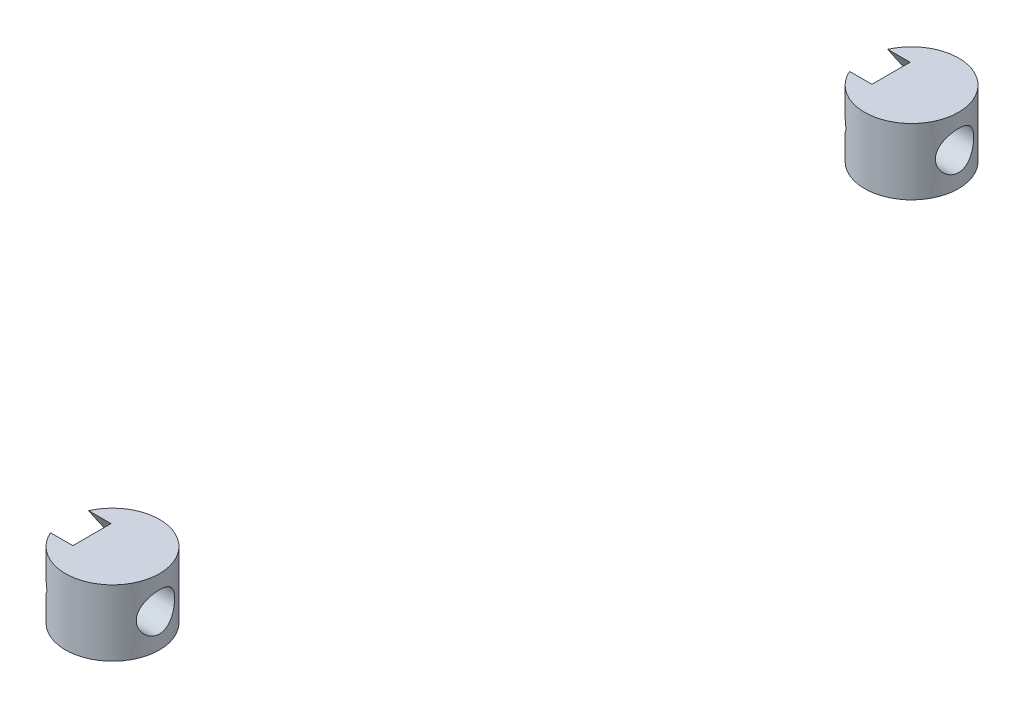
ISO-10303-21;
HEADER;
FILE_DESCRIPTION(('STEP AP214'),'2;1');
FILE_NAME('part.step','',(''),(''),'','','');
FILE_SCHEMA(('AUTOMOTIVE_DESIGN { 1 0 10303 214 1 1 1 1 }'));
ENDSEC;
DATA;
#1=APPLICATION_CONTEXT('core data for automotive mechanical design processes');
#2=APPLICATION_PROTOCOL_DEFINITION('international standard','automotive_design',2000,#1);
#3=PRODUCT_CONTEXT('',#1,'mechanical');
#4=PRODUCT('Part','Part','',(#3));
#5=PRODUCT_RELATED_PRODUCT_CATEGORY('part','',(#4));
#6=PRODUCT_DEFINITION_FORMATION('','',#4);
#7=PRODUCT_DEFINITION_CONTEXT('part definition',#1,'design');
#8=PRODUCT_DEFINITION('design','',#6,#7);
#9=PRODUCT_DEFINITION_SHAPE('','',#8);
#10=(LENGTH_UNIT() NAMED_UNIT(*) SI_UNIT(.MILLI.,.METRE.));
#11=(NAMED_UNIT(*) PLANE_ANGLE_UNIT() SI_UNIT($,.RADIAN.));
#12=(NAMED_UNIT(*) SI_UNIT($,.STERADIAN.) SOLID_ANGLE_UNIT());
#13=UNCERTAINTY_MEASURE_WITH_UNIT(LENGTH_MEASURE(1.E-05),#10,'distance_accuracy_value','');
#14=(GEOMETRIC_REPRESENTATION_CONTEXT(3) GLOBAL_UNCERTAINTY_ASSIGNED_CONTEXT((#13)) GLOBAL_UNIT_ASSIGNED_CONTEXT((#10,
#11,#12)) REPRESENTATION_CONTEXT('',''));
#15=CARTESIAN_POINT('',(0.,0.,0.));
#16=DIRECTION('',(0.,0.,1.));
#17=DIRECTION('',(1.,0.,0.));
#18=AXIS2_PLACEMENT_3D('',#15,#16,#17);
#19=CARTESIAN_POINT('',(-9.025,6.35,76.7));
#20=DIRECTION('',(1.,0.,0.));
#21=DIRECTION('',(0.,0.,-1.));
#22=AXIS2_PLACEMENT_3D('',#19,#20,#21);
#23=CYLINDRICAL_SURFACE('',#22,3.675);
#24=CARTESIAN_POINT('',(8.24287571178894,6.35,73.025));
#25=CARTESIAN_POINT('',(8.24287635200835,6.25172209193004,73.0250006435663));
#26=CARTESIAN_POINT('',(8.24463950445115,6.15340636895207,73.0289482242921));
#27=CARTESIAN_POINT('',(8.2516341947821,5.95748755176273,73.0446983826287));
#28=CARTESIAN_POINT('',(8.25686806215964,5.85988498072126,73.0565062359517));
#29=CARTESIAN_POINT('',(8.27064458742844,5.66594535724324,73.0878872681414));
#30=CARTESIAN_POINT('',(8.27919443665083,5.56961152904888,73.1074773264413));
#31=CARTESIAN_POINT('',(8.29931572789662,5.37910343025143,73.1542104976651));
#32=CARTESIAN_POINT('',(8.31088843780253,5.28493008389492,73.1813567802206));
#33=CARTESIAN_POINT('',(8.34950112738415,5.00742795623176,73.2734965304055));
#34=CARTESIAN_POINT('',(8.38051193052206,4.8281262358787,73.349354005083));
#35=CARTESIAN_POINT('',(8.44955969315188,4.48494141418247,73.5275187377141));
#36=CARTESIAN_POINT('',(8.48759476947754,4.32105419803325,73.6298189094671));
#37=CARTESIAN_POINT('',(8.56894038089361,4.00339374462748,73.8644933161994));
#38=CARTESIAN_POINT('',(8.61242467515415,3.85063969934235,73.9981899136823));
#39=CARTESIAN_POINT('',(8.69833612153945,3.56897779638049,74.2890749448378));
#40=CARTESIAN_POINT('',(8.7407628714523,3.44007889521944,74.4462721620351));
#41=CARTESIAN_POINT('',(8.821874135843,3.20465562489746,74.787635283187));
#42=CARTESIAN_POINT('',(8.86033318135837,3.09926856531822,74.9726440521105));
#43=CARTESIAN_POINT('',(8.92706239153423,2.92155175218724,75.359611041429));
#44=CARTESIAN_POINT('',(8.95533688584077,2.84920794780614,75.5615620142475));
#45=CARTESIAN_POINT('',(8.99728123604548,2.74329576015924,75.9659766868008));
#46=CARTESIAN_POINT('',(9.01161028022033,2.70797042253651,76.1679105009561));
#47=CARTESIAN_POINT('',(9.02643689795595,2.67143219850026,76.5753140089371));
#48=CARTESIAN_POINT('',(9.02693981697954,2.67020612861014,76.7807823055151));
#49=CARTESIAN_POINT('',(9.01445308137315,2.70095617123781,77.1766899570414));
#50=CARTESIAN_POINT('',(9.00224664639766,2.73100491781052,77.367308253818));
#51=CARTESIAN_POINT('',(8.9667769532853,2.82016237175298,77.7405239627416));
#52=CARTESIAN_POINT('',(8.94351288226197,2.87927321559261,77.923120784123));
#53=CARTESIAN_POINT('',(8.88774687972276,3.02559431545221,78.2784294263568));
#54=CARTESIAN_POINT('',(8.85511017828501,3.11321719115933,78.450949297497));
#55=CARTESIAN_POINT('',(8.78381848591454,3.31368115092226,78.77928510923));
#56=CARTESIAN_POINT('',(8.74516140393479,3.42653100296634,78.9350952141811));
#57=CARTESIAN_POINT('',(8.66264265950523,3.68314666108434,79.2367978955274));
#58=CARTESIAN_POINT('',(8.61860582477254,3.82848885606257,79.3813037368879));
#59=CARTESIAN_POINT('',(8.53228763369566,4.14148509819779,79.6444720867788));
#60=CARTESIAN_POINT('',(8.49000689921911,4.30914696225721,79.7631255025843));
#61=CARTESIAN_POINT('',(8.41077118272341,4.66844482022331,79.9745565547352));
#62=CARTESIAN_POINT('',(8.37401547120769,4.8606516918592,80.0664450666085));
#63=CARTESIAN_POINT('',(8.31234279260891,5.25970641210512,80.2159925670086));
#64=CARTESIAN_POINT('',(8.28741780684716,5.46654423452068,80.2736747466771));
#65=CARTESIAN_POINT('',(8.25419279568773,5.87512708363286,80.3497333104287));
#66=CARTESIAN_POINT('',(8.24494769967969,6.07637724944273,80.3703490013328));
#67=CARTESIAN_POINT('',(8.24143255370913,6.47963007174616,80.3782403958429));
#68=CARTESIAN_POINT('',(8.24715769792191,6.68163246596572,80.3655267989876));
#69=CARTESIAN_POINT('',(8.27196520700346,7.06791511332102,80.3091614945367));
#70=CARTESIAN_POINT('',(8.29022645502155,7.25253191562638,80.2674096999523));
#71=CARTESIAN_POINT('',(8.33701683509444,7.61200484974517,80.1566404564726));
#72=CARTESIAN_POINT('',(8.36554829622212,7.78685875713687,80.0876168225386));
#73=CARTESIAN_POINT('',(8.43110547035255,8.12991416969162,79.9210844521227));
#74=CARTESIAN_POINT('',(8.4684336851875,8.29754146280155,79.8225156956635));
#75=CARTESIAN_POINT('',(8.54693065916348,8.6146579401236,79.6007621673222));
#76=CARTESIAN_POINT('',(8.58810102148374,8.76413949242628,79.4775670951274));
#77=CARTESIAN_POINT('',(8.67347379009378,9.0527025861097,79.1988565151429));
#78=CARTESIAN_POINT('',(8.7176653360997,9.19009474250999,79.0415818364197));
#79=CARTESIAN_POINT('',(8.80113256404693,9.43681675245223,78.7051663884421));
#80=CARTESIAN_POINT('',(8.8404079792371,9.54614508357813,78.5260244337018));
#81=CARTESIAN_POINT('',(8.90979537682365,9.73334723914071,78.1500678671241));
#82=CARTESIAN_POINT('',(8.93989906023429,9.81119259712772,77.9532374572668));
#83=CARTESIAN_POINT('',(8.98740936617443,9.93212958495293,77.5477415304938));
#84=CARTESIAN_POINT('',(9.00482316773469,9.97524086631648,77.3390827773405));
#85=CARTESIAN_POINT('',(9.02419972547082,10.0230925942599,76.9309920022592));
#86=CARTESIAN_POINT('',(9.02712289370004,10.030218715373,76.7318832759984));
#87=CARTESIAN_POINT('',(9.01981023820307,10.012246501791,76.3353938060765));
#88=CARTESIAN_POINT('',(9.00957654258989,9.98715337853588,76.1380127881586));
#89=CARTESIAN_POINT('',(8.97759134956026,9.90716465674415,75.7572188325613));
#90=CARTESIAN_POINT('',(8.95622770323864,9.85327114355812,75.573560172301));
#91=CARTESIAN_POINT('',(8.90429361461325,9.71828048169847,75.21793867393));
#92=CARTESIAN_POINT('',(8.87372138448023,9.6371780501162,75.045978114938));
#93=CARTESIAN_POINT('',(8.80465480899495,9.44600292489272,74.7101814845138));
#94=CARTESIAN_POINT('',(8.76586746309063,9.33479744414829,74.547052025764));
#95=CARTESIAN_POINT('',(8.68501247715116,9.08824463756886,74.2410839970443));
#96=CARTESIAN_POINT('',(8.64294369237785,8.9528888654533,74.0982525575668));
#97=CARTESIAN_POINT('',(8.55688244327784,8.65160917107083,73.8273925863474));
#98=CARTESIAN_POINT('',(8.51294070594262,8.48427751251768,73.7009110416483));
#99=CARTESIAN_POINT('',(8.43095316803738,8.12922979473681,73.4775971381483));
#100=CARTESIAN_POINT('',(8.39291059170069,7.94150268286357,73.3807809651779));
#101=CARTESIAN_POINT('',(8.34409768743806,7.64929494245797,73.2607432301747));
#102=CARTESIAN_POINT('',(8.32923800988524,7.55047135087831,73.2250064683778));
#103=CARTESIAN_POINT('',(8.3026886230368,7.34975217087457,73.162040054348));
#104=CARTESIAN_POINT('',(8.2909973722958,7.24785810315077,73.1348062644197));
#105=CARTESIAN_POINT('',(8.27124353271442,7.04205504875808,73.0892146240913));
#106=CARTESIAN_POINT('',(8.2631713477964,6.93815216178342,73.0708332913668));
#107=CARTESIAN_POINT('',(8.25092373196702,6.72897571172967,73.043072851351));
#108=CARTESIAN_POINT('',(8.24674523427927,6.62370329371421,73.0336866590708));
#109=CARTESIAN_POINT('',(8.24402032780168,6.49021203930896,73.027568404048));
#110=CARTESIAN_POINT('',(8.24359134458015,6.46218098581238,73.0266054991886));
#111=CARTESIAN_POINT('',(8.24301894449513,6.40610098190793,73.025321203726));
#112=CARTESIAN_POINT('',(8.24287552904742,6.37805203141203,73.0249998163031));
#113=CARTESIAN_POINT('',(8.24287571178894,6.35,73.025));
#114=B_SPLINE_CURVE_WITH_KNOTS('',3,(#24,#25,#26,#27,#28,#29,#30,#31,#32,#33,#34,#35,#36,#37,
#38,#39,#40,#41,#42,#43,#44,#45,#46,#47,#48,#49,#50,#51,#52,#53,#54,#55,#56,#57,#58,#59,#60,#61,
#62,#63,#64,#65,#66,#67,#68,#69,#70,#71,#72,#73,#74,#75,#76,#77,#78,#79,#80,#81,#82,#83,#84,#85,
#86,#87,#88,#89,#90,#91,#92,#93,#94,#95,#96,#97,#98,#99,#100,#101,#102,#103,#104,#105,#106,#107,
#108,#109,#110,#111,#112,#113),.UNSPECIFIED.,.T.,.F.,(4,2,2,2,2,2,2,2,2,2,2,2,2,2,2,2,2,2,2,2,2,
2,2,2,2,2,2,2,2,2,2,2,2,2,2,2,2,2,2,2,2,2,2,2,4),(0.,0.294804188916925,0.58980644632139,
0.885452081677049,1.18122191975236,1.76977849951031,2.35817751917346,2.97824720901682,
3.59854923644961,4.24434528218107,4.88986646283033,5.50313117295885,6.11615877906913,
6.69352390455187,7.27093148077985,7.85709733601501,8.44346723902179,9.06955698195067,
9.69586657677613,10.3410804714088,10.9858564235891,11.5901727785578,12.1942951565536,
12.7622100645096,13.3302538450987,13.9217907040224,14.5135755014523,15.1509685846609,
15.7883962380845,16.4263989627131,17.0640404700697,17.658796487591,18.253456315868,
18.8286572916528,19.4039700136862,20.0049956742599,20.6062319500066,21.2462114962225,
21.8865396047503,22.2045804601897,22.5224663092809,22.839504214647,23.1562922005524,
23.2404394471741,23.3245871109808),.UNSPECIFIED.);
#115=CARTESIAN_POINT('',(8.24287571178894,6.35,73.025));
#116=VERTEX_POINT('',#115);
#117=EDGE_CURVE('E12',#116,#116,#114,.T.);
#118=ORIENTED_EDGE('',*,*,#117,.F.);
#119=EDGE_LOOP('',(#118));
#120=FACE_BOUND('',#119,.T.);
#121=CARTESIAN_POINT('',(-3.945,6.35,76.7));
#122=DIRECTION('',(-1.,0.,0.));
#123=DIRECTION('',(0.,0.,1.));
#124=AXIS2_PLACEMENT_3D('',#121,#122,#123);
#125=CIRCLE('',#124,3.675);
#126=CARTESIAN_POINT('',(-3.945,6.35,80.375));
#127=VERTEX_POINT('',#126);
#128=EDGE_CURVE('E52',#127,#127,#125,.F.);
#129=ORIENTED_EDGE('',*,*,#128,.F.);
#130=EDGE_LOOP('',(#129));
#131=FACE_BOUND('',#130,.T.);
#132=ADVANCED_FACE('F47',(#120,#131),#23,.F.);
#133=CARTESIAN_POINT('',(0.,12.7,76.7));
#134=DIRECTION('',(0.,-1.,0.));
#135=DIRECTION('',(0.,0.,-1.));
#136=AXIS2_PLACEMENT_3D('',#133,#134,#135);
#137=CYLINDRICAL_SURFACE('',#136,9.025);
#138=ORIENTED_EDGE('',*,*,#117,.T.);
#139=EDGE_LOOP('',(#138));
#140=FACE_BOUND('',#139,.T.);
#141=CARTESIAN_POINT('',(0.,0.,76.7));
#142=DIRECTION('',(0.,1.,0.));
#143=DIRECTION('',(0.,0.,1.));
#144=AXIS2_PLACEMENT_3D('',#141,#142,#143);
#145=CIRCLE('',#144,9.025);
#146=CARTESIAN_POINT('',(-8.2468049368629,0.,80.3661742093542));
#147=VERTEX_POINT('',#146);
#148=CARTESIAN_POINT('',(-8.24680493686297,0.,73.033825790646));
#149=VERTEX_POINT('',#148);
#150=EDGE_CURVE('E124',#147,#149,#145,.T.);
#151=ORIENTED_EDGE('',*,*,#150,.T.);
#152=CARTESIAN_POINT('',(0.,-6.34999999999971,76.7));
#153=DIRECTION('',(0.,-0.500000000000006,-0.866025403784435));
#154=DIRECTION('',(0.,-0.866025403784435,0.500000000000006));
#155=AXIS2_PLACEMENT_3D('',#152,#153,#154);
#156=ELLIPSE('',#155,18.0499999999998,9.025);
#157=CARTESIAN_POINT('',(-5.26187149849438,6.34999999999999,69.3676515812918));
#158=VERTEX_POINT('',#157);
#159=EDGE_CURVE('E134',#149,#158,#156,.T.);
#160=ORIENTED_EDGE('',*,*,#159,.T.);
#161=CARTESIAN_POINT('',(0.,19.0500000000002,76.7));
#162=DIRECTION('',(0.,0.499999999999991,-0.866025403784444));
#163=DIRECTION('',(0.,-0.866025403784444,-0.499999999999991));
#164=AXIS2_PLACEMENT_3D('',#161,#162,#163);
#165=ELLIPSE('',#164,18.0500000000003,9.025);
#166=CARTESIAN_POINT('',(-8.24680493686291,12.7,73.0338257906458));
#167=VERTEX_POINT('',#166);
#168=EDGE_CURVE('E140',#158,#167,#165,.T.);
#169=ORIENTED_EDGE('',*,*,#168,.T.);
#170=CARTESIAN_POINT('',(0.,12.7,76.7));
#171=DIRECTION('',(0.,1.,0.));
#172=DIRECTION('',(0.,0.,1.));
#173=AXIS2_PLACEMENT_3D('',#170,#171,#172);
#174=CIRCLE('',#173,9.025);
#175=CARTESIAN_POINT('',(-8.24680493686295,12.7,80.3661742093541));
#176=VERTEX_POINT('',#175);
#177=EDGE_CURVE('E57',#176,#167,#174,.T.);
#178=ORIENTED_EDGE('',*,*,#177,.F.);
#179=CARTESIAN_POINT('',(0.,19.0499999999998,76.7));
#180=DIRECTION('',(0.,0.500000000000009,0.866025403784434));
#181=DIRECTION('',(0.,-0.866025403784434,0.500000000000009));
#182=AXIS2_PLACEMENT_3D('',#179,#180,#181);
#183=ELLIPSE('',#182,18.0499999999997,9.025);
#184=CARTESIAN_POINT('',(-5.26187149849428,6.35000000000005,84.0323484187083));
#185=VERTEX_POINT('',#184);
#186=EDGE_CURVE('E137',#176,#185,#183,.T.);
#187=ORIENTED_EDGE('',*,*,#186,.T.);
#188=CARTESIAN_POINT('',(0.,-6.35000000000022,76.7));
#189=DIRECTION('',(0.,-0.499999999999993,0.866025403784443));
#190=DIRECTION('',(0.,-0.866025403784443,-0.499999999999993));
#191=AXIS2_PLACEMENT_3D('',#188,#189,#190);
#192=ELLIPSE('',#191,18.0500000000003,9.025);
#193=EDGE_CURVE('E132',#185,#147,#192,.T.);
#194=ORIENTED_EDGE('',*,*,#193,.T.);
#195=EDGE_LOOP('',(#151,#160,#169,#178,#187,#194));
#196=FACE_BOUND('',#195,.T.);
#197=ADVANCED_FACE('F49',(#140,#196),#137,.T.);
#198=CARTESIAN_POINT('',(0.,12.7,76.7));
#199=DIRECTION('',(0.,1.,0.));
#200=DIRECTION('',(0.,0.,1.));
#201=AXIS2_PLACEMENT_3D('',#198,#199,#200);
#202=PLANE('',#201);
#203=DIRECTION('',(-1.,0.,0.));
#204=VECTOR('',#203,1.);
#205=CARTESIAN_POINT('',(-3.945,12.7,73.0338257906458));
#206=LINE('',#205,#204);
#207=CARTESIAN_POINT('',(-3.945,12.7,73.0338257906458));
#208=VERTEX_POINT('',#207);
#209=EDGE_CURVE('E72',#208,#167,#206,.T.);
#210=ORIENTED_EDGE('',*,*,#209,.F.);
#211=DIRECTION('',(0.,0.,-1.));
#212=VECTOR('',#211,1.);
#213=CARTESIAN_POINT('',(-3.945,12.7,80.3661742093541));
#214=LINE('',#213,#212);
#215=CARTESIAN_POINT('',(-3.945,12.7,80.3661742093541));
#216=VERTEX_POINT('',#215);
#217=EDGE_CURVE('E225',#216,#208,#214,.T.);
#218=ORIENTED_EDGE('',*,*,#217,.F.);
#219=DIRECTION('',(-1.,0.,0.));
#220=VECTOR('',#219,1.);
#221=CARTESIAN_POINT('',(-3.945,12.7,80.3661742093541));
#222=LINE('',#221,#220);
#223=EDGE_CURVE('E126',#216,#176,#222,.T.);
#224=ORIENTED_EDGE('',*,*,#223,.T.);
#225=ORIENTED_EDGE('',*,*,#177,.T.);
#226=EDGE_LOOP('',(#210,#218,#224,#225));
#227=FACE_BOUND('',#226,.T.);
#228=ADVANCED_FACE('F154',(#227),#202,.T.);
#229=CARTESIAN_POINT('',(0.,0.,76.7));
#230=DIRECTION('',(0.,1.,0.));
#231=DIRECTION('',(0.,0.,1.));
#232=AXIS2_PLACEMENT_3D('',#229,#230,#231);
#233=PLANE('',#232);
#234=DIRECTION('',(0.,0.,1.));
#235=VECTOR('',#234,1.);
#236=CARTESIAN_POINT('',(-3.945,0.,73.033825790646));
#237=LINE('',#236,#235);
#238=CARTESIAN_POINT('',(-3.945,0.,73.033825790646));
#239=VERTEX_POINT('',#238);
#240=CARTESIAN_POINT('',(-3.945,0.,80.3661742093542));
#241=VERTEX_POINT('',#240);
#242=EDGE_CURVE('E113',#239,#241,#237,.T.);
#243=ORIENTED_EDGE('',*,*,#242,.F.);
#244=DIRECTION('',(-1.,0.,0.));
#245=VECTOR('',#244,1.);
#246=CARTESIAN_POINT('',(-3.945,0.,73.033825790646));
#247=LINE('',#246,#245);
#248=EDGE_CURVE('E230',#239,#149,#247,.T.);
#249=ORIENTED_EDGE('',*,*,#248,.T.);
#250=ORIENTED_EDGE('',*,*,#150,.F.);
#251=DIRECTION('',(-1.,0.,0.));
#252=VECTOR('',#251,1.);
#253=CARTESIAN_POINT('',(-3.945,0.,80.3661742093542));
#254=LINE('',#253,#252);
#255=EDGE_CURVE('E106',#241,#147,#254,.T.);
#256=ORIENTED_EDGE('',*,*,#255,.F.);
#257=EDGE_LOOP('',(#243,#249,#250,#256));
#258=FACE_BOUND('',#257,.T.);
#259=ADVANCED_FACE('F122',(#258),#233,.F.);
#260=CARTESIAN_POINT('',(-3.945,12.7,73.0338257906458));
#261=DIRECTION('',(0.,0.499999999999991,-0.866025403784444));
#262=DIRECTION('',(0.,0.866025403784444,0.499999999999991));
#263=AXIS2_PLACEMENT_3D('',#260,#261,#262);
#264=PLANE('',#263);
#265=DIRECTION('',(-1.,0.,0.));
#266=VECTOR('',#265,1.);
#267=CARTESIAN_POINT('',(-3.945,6.34999999999999,69.3676515812918));
#268=LINE('',#267,#266);
#269=CARTESIAN_POINT('',(-3.945,6.34999999999999,69.3676515812918));
#270=VERTEX_POINT('',#269);
#271=EDGE_CURVE('E232',#270,#158,#268,.T.);
#272=ORIENTED_EDGE('',*,*,#271,.F.);
#273=DIRECTION('',(0.,-0.866025403784444,-0.499999999999991));
#274=VECTOR('',#273,1.);
#275=CARTESIAN_POINT('',(-3.945,12.7,73.0338257906458));
#276=LINE('',#275,#274);
#277=EDGE_CURVE('E128',#208,#270,#276,.T.);
#278=ORIENTED_EDGE('',*,*,#277,.F.);
#279=ORIENTED_EDGE('',*,*,#209,.T.);
#280=ORIENTED_EDGE('',*,*,#168,.F.);
#281=EDGE_LOOP('',(#272,#278,#279,#280));
#282=FACE_BOUND('',#281,.T.);
#283=ADVANCED_FACE('F158',(#282),#264,.F.);
#284=CARTESIAN_POINT('',(-3.945,6.35000000000005,84.0323484187083));
#285=DIRECTION('',(0.,0.500000000000009,0.866025403784434));
#286=DIRECTION('',(0.,-0.866025403784434,0.500000000000009));
#287=AXIS2_PLACEMENT_3D('',#284,#285,#286);
#288=PLANE('',#287);
#289=ORIENTED_EDGE('',*,*,#223,.F.);
#290=DIRECTION('',(0.,0.866025403784434,-0.500000000000009));
#291=VECTOR('',#290,1.);
#292=CARTESIAN_POINT('',(-3.945,6.35000000000005,84.0323484187083));
#293=LINE('',#292,#291);
#294=CARTESIAN_POINT('',(-3.945,6.35000000000005,84.0323484187083));
#295=VERTEX_POINT('',#294);
#296=EDGE_CURVE('E112',#295,#216,#293,.T.);
#297=ORIENTED_EDGE('',*,*,#296,.F.);
#298=DIRECTION('',(-1.,0.,0.));
#299=VECTOR('',#298,1.);
#300=CARTESIAN_POINT('',(-3.945,6.35000000000005,84.0323484187083));
#301=LINE('',#300,#299);
#302=EDGE_CURVE('E109',#295,#185,#301,.T.);
#303=ORIENTED_EDGE('',*,*,#302,.T.);
#304=ORIENTED_EDGE('',*,*,#186,.F.);
#305=EDGE_LOOP('',(#289,#297,#303,#304));
#306=FACE_BOUND('',#305,.T.);
#307=ADVANCED_FACE('F162',(#306),#288,.F.);
#308=CARTESIAN_POINT('',(-3.945,6.34999999999999,69.3676515812918));
#309=DIRECTION('',(0.,-0.500000000000006,-0.866025403784435));
#310=DIRECTION('',(0.,0.866025403784435,-0.500000000000006));
#311=AXIS2_PLACEMENT_3D('',#308,#309,#310);
#312=PLANE('',#311);
#313=ORIENTED_EDGE('',*,*,#248,.F.);
#314=DIRECTION('',(0.,-0.866025403784435,0.500000000000006));
#315=VECTOR('',#314,1.);
#316=CARTESIAN_POINT('',(-3.945,6.34999999999999,69.3676515812918));
#317=LINE('',#316,#315);
#318=EDGE_CURVE('E64',#270,#239,#317,.T.);
#319=ORIENTED_EDGE('',*,*,#318,.F.);
#320=ORIENTED_EDGE('',*,*,#271,.T.);
#321=ORIENTED_EDGE('',*,*,#159,.F.);
#322=EDGE_LOOP('',(#313,#319,#320,#321));
#323=FACE_BOUND('',#322,.T.);
#324=ADVANCED_FACE('F167',(#323),#312,.F.);
#325=CARTESIAN_POINT('',(-3.945,0.,80.3661742093542));
#326=DIRECTION('',(0.,-0.499999999999993,0.866025403784443));
#327=DIRECTION('',(0.,-0.866025403784443,-0.499999999999993));
#328=AXIS2_PLACEMENT_3D('',#325,#326,#327);
#329=PLANE('',#328);
#330=ORIENTED_EDGE('',*,*,#302,.F.);
#331=DIRECTION('',(0.,0.866025403784443,0.499999999999993));
#332=VECTOR('',#331,1.);
#333=CARTESIAN_POINT('',(-3.945,0.,80.3661742093542));
#334=LINE('',#333,#332);
#335=EDGE_CURVE('E103',#241,#295,#334,.T.);
#336=ORIENTED_EDGE('',*,*,#335,.F.);
#337=ORIENTED_EDGE('',*,*,#255,.T.);
#338=ORIENTED_EDGE('',*,*,#193,.F.);
#339=EDGE_LOOP('',(#330,#336,#337,#338));
#340=FACE_BOUND('',#339,.T.);
#341=ADVANCED_FACE('F104',(#340),#329,.F.);
#342=CARTESIAN_POINT('',(-3.945,0.,0.));
#343=DIRECTION('',(-1.,0.,0.));
#344=DIRECTION('',(0.,0.,1.));
#345=AXIS2_PLACEMENT_3D('',#342,#343,#344);
#346=PLANE('',#345);
#347=ORIENTED_EDGE('',*,*,#242,.T.);
#348=ORIENTED_EDGE('',*,*,#335,.T.);
#349=ORIENTED_EDGE('',*,*,#296,.T.);
#350=ORIENTED_EDGE('',*,*,#217,.T.);
#351=ORIENTED_EDGE('',*,*,#277,.T.);
#352=ORIENTED_EDGE('',*,*,#318,.T.);
#353=EDGE_LOOP('',(#347,#348,#349,#350,#351,#352));
#354=FACE_BOUND('',#353,.T.);
#355=ORIENTED_EDGE('',*,*,#128,.T.);
#356=EDGE_LOOP('',(#355));
#357=FACE_BOUND('',#356,.T.);
#358=ADVANCED_FACE('F116',(#354,#357),#346,.T.);
#359=CLOSED_SHELL('',(#132,#197,#228,#259,#283,#307,#324,#341,#358));
#360=MANIFOLD_SOLID_BREP('B2',#359);
#361=CARTESIAN_POINT('',(0.,12.7,-76.7));
#362=DIRECTION('',(0.,-1.,0.));
#363=DIRECTION('',(0.,0.,-1.));
#364=AXIS2_PLACEMENT_3D('',#361,#362,#363);
#365=CYLINDRICAL_SURFACE('',#364,9.025);
#366=CARTESIAN_POINT('',(8.24287571178894,6.35000000000002,-80.375));
#367=CARTESIAN_POINT('',(8.24287635200835,6.25172209193005,-80.3749993564336));
#368=CARTESIAN_POINT('',(8.24463950445115,6.1534063689521,-80.3710517757079));
#369=CARTESIAN_POINT('',(8.2516341947821,5.95748755176275,-80.3553016173713));
#370=CARTESIAN_POINT('',(8.25686806215964,5.85988498072129,-80.3434937640483));
#371=CARTESIAN_POINT('',(8.27064458742844,5.66594535724326,-80.3121127318586));
#372=CARTESIAN_POINT('',(8.27919443665083,5.5696115290489,-80.2925226735587));
#373=CARTESIAN_POINT('',(8.29931572789662,5.37910343025145,-80.2457895023349));
#374=CARTESIAN_POINT('',(8.31088843780253,5.28493008389494,-80.2186432197794));
#375=CARTESIAN_POINT('',(8.34950112738415,5.00742795623178,-80.1265034695945));
#376=CARTESIAN_POINT('',(8.38051193052206,4.82812623587872,-80.050645994917));
#377=CARTESIAN_POINT('',(8.44955969315188,4.48494141418249,-79.8724812622859));
#378=CARTESIAN_POINT('',(8.48759476947754,4.32105419803327,-79.7701810905329));
#379=CARTESIAN_POINT('',(8.56894038089361,4.0033937446275,-79.5355066838006));
#380=CARTESIAN_POINT('',(8.61242467515415,3.85063969934236,-79.4018100863176));
#381=CARTESIAN_POINT('',(8.69833612153945,3.56897779638051,-79.1109250551622));
#382=CARTESIAN_POINT('',(8.7407628714523,3.44007889521946,-78.9537278379649));
#383=CARTESIAN_POINT('',(8.821874135843,3.20465562489748,-78.6123647168129));
#384=CARTESIAN_POINT('',(8.86033318135837,3.09926856531824,-78.4273559478895));
#385=CARTESIAN_POINT('',(8.92706239153423,2.92155175218726,-78.040388958571));
#386=CARTESIAN_POINT('',(8.95533688584077,2.84920794780616,-77.8384379857524));
#387=CARTESIAN_POINT('',(8.99728123604548,2.74329576015926,-77.4340233131992));
#388=CARTESIAN_POINT('',(9.01161028022033,2.70797042253653,-77.2320894990439));
#389=CARTESIAN_POINT('',(9.02643689795595,2.67143219850028,-76.8246859910629));
#390=CARTESIAN_POINT('',(9.02693981697954,2.67020612861016,-76.6192176944849));
#391=CARTESIAN_POINT('',(9.01445308137315,2.70095617123783,-76.2233100429586));
#392=CARTESIAN_POINT('',(9.00224664639766,2.73100491781055,-76.032691746182));
#393=CARTESIAN_POINT('',(8.96677695328529,2.820162371753,-75.6594760372584));
#394=CARTESIAN_POINT('',(8.94351288226197,2.87927321559263,-75.476879215877));
#395=CARTESIAN_POINT('',(8.88774687972277,3.02559431545222,-75.1215705736432));
#396=CARTESIAN_POINT('',(8.85511017828502,3.11321719115934,-74.949050702503));
#397=CARTESIAN_POINT('',(8.78381848591454,3.31368115092227,-74.62071489077));
#398=CARTESIAN_POINT('',(8.7451614039348,3.42653100296636,-74.4649047858189));
#399=CARTESIAN_POINT('',(8.66264265950523,3.68314666108436,-74.1632021044726));
#400=CARTESIAN_POINT('',(8.61860582477254,3.82848885606259,-74.018696263112));
#401=CARTESIAN_POINT('',(8.53228763369566,4.14148509819781,-73.7555279132212));
#402=CARTESIAN_POINT('',(8.49000689921911,4.30914696225723,-73.6368744974157));
#403=CARTESIAN_POINT('',(8.41077118272341,4.66844482022333,-73.4254434452648));
#404=CARTESIAN_POINT('',(8.37401547120769,4.86065169185922,-73.3335549333914));
#405=CARTESIAN_POINT('',(8.31234279260891,5.25970641210513,-73.1840074329914));
#406=CARTESIAN_POINT('',(8.28741780684716,5.4665442345207,-73.1263252533229));
#407=CARTESIAN_POINT('',(8.25419279568773,5.87512708363287,-73.0502666895713));
#408=CARTESIAN_POINT('',(8.24494769967969,6.07637724944275,-73.0296509986672));
#409=CARTESIAN_POINT('',(8.24143255370913,6.47963007174618,-73.0217596041571));
#410=CARTESIAN_POINT('',(8.24715769792191,6.68163246596574,-73.0344732010124));
#411=CARTESIAN_POINT('',(8.27196520700346,7.06791511332104,-73.0908385054633));
#412=CARTESIAN_POINT('',(8.29022645502155,7.2525319156264,-73.1325903000477));
#413=CARTESIAN_POINT('',(8.33701683509444,7.61200484974519,-73.2433595435274));
#414=CARTESIAN_POINT('',(8.36554829622212,7.78685875713689,-73.3123831774614));
#415=CARTESIAN_POINT('',(8.43110547035255,8.12991416969164,-73.4789155478772));
#416=CARTESIAN_POINT('',(8.4684336851875,8.29754146280157,-73.5774843043365));
#417=CARTESIAN_POINT('',(8.54693065916348,8.61465794012362,-73.7992378326777));
#418=CARTESIAN_POINT('',(8.58810102148374,8.7641394924263,-73.9224329048726));
#419=CARTESIAN_POINT('',(8.67347379009378,9.05270258610972,-74.201143484857));
#420=CARTESIAN_POINT('',(8.7176653360997,9.19009474251001,-74.3584181635803));
#421=CARTESIAN_POINT('',(8.80113256404693,9.43681675245224,-74.6948336115579));
#422=CARTESIAN_POINT('',(8.8404079792371,9.54614508357815,-74.8739755662982));
#423=CARTESIAN_POINT('',(8.90979537682365,9.73334723914073,-75.2499321328759));
#424=CARTESIAN_POINT('',(8.93989906023429,9.81119259712775,-75.4467625427332));
#425=CARTESIAN_POINT('',(8.98740936617443,9.93212958495295,-75.8522584695062));
#426=CARTESIAN_POINT('',(9.00482316773469,9.9752408663165,-76.0609172226595));
#427=CARTESIAN_POINT('',(9.02419972547082,10.0230925942599,-76.4690079977407));
#428=CARTESIAN_POINT('',(9.02712289370004,10.030218715373,-76.6681167240016));
#429=CARTESIAN_POINT('',(9.01981023820307,10.012246501791,-77.0646061939235));
#430=CARTESIAN_POINT('',(9.00957654258989,9.9871533785359,-77.2619872118414));
#431=CARTESIAN_POINT('',(8.97759134956026,9.90716465674417,-77.6427811674387));
#432=CARTESIAN_POINT('',(8.95622770323864,9.85327114355813,-77.826439827699));
#433=CARTESIAN_POINT('',(8.90429361461325,9.71828048169849,-78.18206132607));
#434=CARTESIAN_POINT('',(8.87372138448023,9.63717805011622,-78.3540218850619));
#435=CARTESIAN_POINT('',(8.80465480899495,9.44600292489273,-78.6898185154861));
#436=CARTESIAN_POINT('',(8.76586746309063,9.33479744414831,-78.852947974236));
#437=CARTESIAN_POINT('',(8.68501247715117,9.08824463756888,-79.1589160029557));
#438=CARTESIAN_POINT('',(8.64294369237785,8.95288886545333,-79.3017474424332));
#439=CARTESIAN_POINT('',(8.55688244327784,8.65160917107085,-79.5726074136526));
#440=CARTESIAN_POINT('',(8.51294070594262,8.4842775125177,-79.6990889583517));
#441=CARTESIAN_POINT('',(8.43095316803738,8.12922979473683,-79.9224028618517));
#442=CARTESIAN_POINT('',(8.39291059170069,7.94150268286359,-80.0192190348221));
#443=CARTESIAN_POINT('',(8.34409768743806,7.64929494245799,-80.1392567698252));
#444=CARTESIAN_POINT('',(8.32923800988525,7.55047135087834,-80.1749935316222));
#445=CARTESIAN_POINT('',(8.3026886230368,7.3497521708746,-80.237959945652));
#446=CARTESIAN_POINT('',(8.2909973722958,7.2478581031508,-80.2651937355803));
#447=CARTESIAN_POINT('',(8.27124353271442,7.04205504875811,-80.3107853759087));
#448=CARTESIAN_POINT('',(8.2631713477964,6.93815216178345,-80.3291667086332));
#449=CARTESIAN_POINT('',(8.25092373196702,6.7289757117297,-80.356927148649));
#450=CARTESIAN_POINT('',(8.24674523427927,6.62370329371423,-80.3663133409291));
#451=CARTESIAN_POINT('',(8.24402032780168,6.49021203930898,-80.372431595952));
#452=CARTESIAN_POINT('',(8.24359134458015,6.4621809858124,-80.3733945008114));
#453=CARTESIAN_POINT('',(8.24301894449513,6.40610098190795,-80.374678796274));
#454=CARTESIAN_POINT('',(8.24287552904742,6.37805203141204,-80.3750001836969));
#455=CARTESIAN_POINT('',(8.24287571178894,6.35000000000002,-80.375));
#456=B_SPLINE_CURVE_WITH_KNOTS('',3,(#366,#367,#368,#369,#370,#371,#372,#373,#374,#375,#376,
#377,#378,#379,#380,#381,#382,#383,#384,#385,#386,#387,#388,#389,#390,#391,#392,#393,#394,#395,
#396,#397,#398,#399,#400,#401,#402,#403,#404,#405,#406,#407,#408,#409,#410,#411,#412,#413,#414,
#415,#416,#417,#418,#419,#420,#421,#422,#423,#424,#425,#426,#427,#428,#429,#430,#431,#432,#433,
#434,#435,#436,#437,#438,#439,#440,#441,#442,#443,#444,#445,#446,#447,#448,#449,#450,#451,#452,
#453,#454,#455),.UNSPECIFIED.,.T.,.F.,(4,2,2,2,2,2,2,2,2,2,2,2,2,2,2,2,2,2,2,2,2,2,2,2,2,2,2,2,
2,2,2,2,2,2,2,2,2,2,2,2,2,2,2,2,4),(0.,0.294804188916923,0.589806446321389,0.885452081677049,
1.18122191975236,1.76977849951031,2.35817751917346,2.97824720901682,3.59854923644961,
4.24434528218107,4.88986646283033,5.50313117295885,6.11615877906913,6.69352390455187,
7.27093148077985,7.85709733601499,8.44346723902179,9.06955698195068,9.69586657677613,
10.3410804714088,10.9858564235891,11.5901727785578,12.1942951565536,12.7622100645096,
13.3302538450987,13.9217907040224,14.5135755014523,15.1509685846609,15.7883962380845,
16.4263989627131,17.0640404700697,17.658796487591,18.253456315868,18.8286572916528,
19.4039700136862,20.0049956742599,20.6062319500066,21.2462114962225,21.8865396047503,
22.2045804601896,22.5224663092809,22.839504214647,23.1562922005524,23.2404394471741,
23.3245871109808),.UNSPECIFIED.);
#457=CARTESIAN_POINT('',(8.24287571178894,6.35000000000002,-80.375));
#458=VERTEX_POINT('',#457);
#459=EDGE_CURVE('E45',#458,#458,#456,.T.);
#460=ORIENTED_EDGE('',*,*,#459,.T.);
#461=EDGE_LOOP('',(#460));
#462=FACE_BOUND('',#461,.T.);
#463=CARTESIAN_POINT('',(0.,0.,-76.7));
#464=DIRECTION('',(0.,1.,0.));
#465=DIRECTION('',(0.,0.,1.));
#466=AXIS2_PLACEMENT_3D('',#463,#464,#465);
#467=CIRCLE('',#466,9.025);
#468=CARTESIAN_POINT('',(-8.24680493686297,0.,-73.033825790646));
#469=VERTEX_POINT('',#468);
#470=CARTESIAN_POINT('',(-8.24680493686289,0.,-80.3661742093542));
#471=VERTEX_POINT('',#470);
#472=EDGE_CURVE('E353',#469,#471,#467,.T.);
#473=ORIENTED_EDGE('',*,*,#472,.T.);
#474=CARTESIAN_POINT('',(0.,-6.35000000000021,-76.7));
#475=DIRECTION('',(0.,-0.499999999999995,-0.866025403784442));
#476=DIRECTION('',(0.,-0.866025403784442,0.499999999999995));
#477=AXIS2_PLACEMENT_3D('',#474,#475,#476);
#478=ELLIPSE('',#477,18.0500000000002,9.025);
#479=CARTESIAN_POINT('',(-5.26187149849426,6.35000000000003,-84.0323484187083));
#480=VERTEX_POINT('',#479);
#481=EDGE_CURVE('E345',#471,#480,#478,.T.);
#482=ORIENTED_EDGE('',*,*,#481,.T.);
#483=CARTESIAN_POINT('',(0.,19.0499999999997,-76.7));
#484=DIRECTION('',(0.,0.50000000000001,-0.866025403784433));
#485=DIRECTION('',(0.,-0.866025403784433,-0.50000000000001));
#486=AXIS2_PLACEMENT_3D('',#483,#484,#485);
#487=ELLIPSE('',#486,18.0499999999996,9.025);
#488=CARTESIAN_POINT('',(-8.24680493686295,12.7,-80.3661742093541));
#489=VERTEX_POINT('',#488);
#490=EDGE_CURVE('E351',#480,#489,#487,.T.);
#491=ORIENTED_EDGE('',*,*,#490,.T.);
#492=CARTESIAN_POINT('',(0.,12.7,-76.7));
#493=DIRECTION('',(0.,1.,0.));
#494=DIRECTION('',(0.,0.,1.));
#495=AXIS2_PLACEMENT_3D('',#492,#493,#494);
#496=CIRCLE('',#495,9.025);
#497=CARTESIAN_POINT('',(-8.24680493686292,12.7,-73.0338257906458));
#498=VERTEX_POINT('',#497);
#499=EDGE_CURVE('E258',#498,#489,#496,.T.);
#500=ORIENTED_EDGE('',*,*,#499,.F.);
#501=CARTESIAN_POINT('',(0.,19.0500000000002,-76.7));
#502=DIRECTION('',(0.,0.499999999999993,0.866025403784443));
#503=DIRECTION('',(0.,-0.866025403784443,0.499999999999993));
#504=AXIS2_PLACEMENT_3D('',#501,#502,#503);
#505=ELLIPSE('',#504,18.0500000000003,9.025);
#506=CARTESIAN_POINT('',(-5.26187149849436,6.34999999999998,-69.3676515812918));
#507=VERTEX_POINT('',#506);
#508=EDGE_CURVE('E349',#498,#507,#505,.T.);
#509=ORIENTED_EDGE('',*,*,#508,.T.);
#510=CARTESIAN_POINT('',(0.,-6.34999999999971,-76.7));
#511=DIRECTION('',(0.,-0.500000000000007,0.866025403784434));
#512=DIRECTION('',(0.,-0.866025403784435,-0.500000000000007));
#513=AXIS2_PLACEMENT_3D('',#510,#511,#512);
#514=ELLIPSE('',#513,18.0499999999997,9.025);
#515=EDGE_CURVE('E310',#507,#469,#514,.T.);
#516=ORIENTED_EDGE('',*,*,#515,.T.);
#517=EDGE_LOOP('',(#473,#482,#491,#500,#509,#516));
#518=FACE_BOUND('',#517,.T.);
#519=ADVANCED_FACE('F249',(#462,#518),#365,.T.);
#520=CARTESIAN_POINT('',(0.,12.7,-76.7));
#521=DIRECTION('',(0.,1.,0.));
#522=DIRECTION('',(0.,0.,1.));
#523=AXIS2_PLACEMENT_3D('',#520,#521,#522);
#524=PLANE('',#523);
#525=DIRECTION('',(-1.,0.,0.));
#526=VECTOR('',#525,1.);
#527=CARTESIAN_POINT('',(-3.945,12.7,-80.3661742093541));
#528=LINE('',#527,#526);
#529=CARTESIAN_POINT('',(-3.945,12.7,-80.3661742093541));
#530=VERTEX_POINT('',#529);
#531=EDGE_CURVE('E273',#530,#489,#528,.T.);
#532=ORIENTED_EDGE('',*,*,#531,.F.);
#533=DIRECTION('',(0.,0.,-1.));
#534=VECTOR('',#533,1.);
#535=CARTESIAN_POINT('',(-3.945,12.7,-80.3661742093541));
#536=LINE('',#535,#534);
#537=CARTESIAN_POINT('',(-3.945,12.7,-73.0338257906458));
#538=VERTEX_POINT('',#537);
#539=EDGE_CURVE('E322',#538,#530,#536,.T.);
#540=ORIENTED_EDGE('',*,*,#539,.F.);
#541=DIRECTION('',(-1.,0.,0.));
#542=VECTOR('',#541,1.);
#543=CARTESIAN_POINT('',(-3.945,12.7,-73.0338257906458));
#544=LINE('',#543,#542);
#545=EDGE_CURVE('E313',#538,#498,#544,.T.);
#546=ORIENTED_EDGE('',*,*,#545,.T.);
#547=ORIENTED_EDGE('',*,*,#499,.T.);
#548=EDGE_LOOP('',(#532,#540,#546,#547));
#549=FACE_BOUND('',#548,.T.);
#550=ADVANCED_FACE('F370',(#549),#524,.T.);
#551=CARTESIAN_POINT('',(0.,0.,-76.7));
#552=DIRECTION('',(0.,1.,0.));
#553=DIRECTION('',(0.,0.,1.));
#554=AXIS2_PLACEMENT_3D('',#551,#552,#553);
#555=PLANE('',#554);
#556=ORIENTED_EDGE('',*,*,#472,.F.);
#557=DIRECTION('',(-1.,0.,0.));
#558=VECTOR('',#557,1.);
#559=CARTESIAN_POINT('',(-3.945,0.,-73.033825790646));
#560=LINE('',#559,#558);
#561=CARTESIAN_POINT('',(-3.945,0.,-73.033825790646));
#562=VERTEX_POINT('',#561);
#563=EDGE_CURVE('E335',#562,#469,#560,.T.);
#564=ORIENTED_EDGE('',*,*,#563,.F.);
#565=DIRECTION('',(0.,0.,1.));
#566=VECTOR('',#565,1.);
#567=CARTESIAN_POINT('',(-3.945,0.,-73.033825790646));
#568=LINE('',#567,#566);
#569=CARTESIAN_POINT('',(-3.945,0.,-80.3661742093542));
#570=VERTEX_POINT('',#569);
#571=EDGE_CURVE('E314',#570,#562,#568,.T.);
#572=ORIENTED_EDGE('',*,*,#571,.F.);
#573=DIRECTION('',(-1.,0.,0.));
#574=VECTOR('',#573,1.);
#575=CARTESIAN_POINT('',(-3.945,0.,-80.3661742093542));
#576=LINE('',#575,#574);
#577=EDGE_CURVE('E337',#570,#471,#576,.T.);
#578=ORIENTED_EDGE('',*,*,#577,.T.);
#579=EDGE_LOOP('',(#556,#564,#572,#578));
#580=FACE_BOUND('',#579,.T.);
#581=ADVANCED_FACE('F367',(#580),#555,.F.);
#582=CARTESIAN_POINT('',(-9.025,6.35000000000002,-76.7));
#583=DIRECTION('',(1.,0.,0.));
#584=DIRECTION('',(0.,0.,-1.));
#585=AXIS2_PLACEMENT_3D('',#582,#583,#584);
#586=CYLINDRICAL_SURFACE('',#585,3.675);
#587=CARTESIAN_POINT('',(-3.945,6.35000000000002,-76.7));
#588=DIRECTION('',(1.,0.,0.));
#589=DIRECTION('',(0.,0.,-1.));
#590=AXIS2_PLACEMENT_3D('',#587,#588,#589);
#591=CIRCLE('',#590,3.675);
#592=CARTESIAN_POINT('',(-3.945,6.35000000000002,-80.375));
#593=VERTEX_POINT('',#592);
#594=EDGE_CURVE('E253',#593,#593,#591,.F.);
#595=ORIENTED_EDGE('',*,*,#594,.T.);
#596=EDGE_LOOP('',(#595));
#597=FACE_BOUND('',#596,.T.);
#598=ORIENTED_EDGE('',*,*,#459,.F.);
#599=EDGE_LOOP('',(#598));
#600=FACE_BOUND('',#599,.T.);
#601=ADVANCED_FACE('F361',(#597,#600),#586,.F.);
#602=CARTESIAN_POINT('',(-3.945,6.35000000000003,-84.0323484187083));
#603=DIRECTION('',(0.,0.50000000000001,-0.866025403784433));
#604=DIRECTION('',(0.,0.866025403784433,0.50000000000001));
#605=AXIS2_PLACEMENT_3D('',#602,#603,#604);
#606=PLANE('',#605);
#607=DIRECTION('',(-1.,0.,0.));
#608=VECTOR('',#607,1.);
#609=CARTESIAN_POINT('',(-3.945,6.35000000000003,-84.0323484187083));
#610=LINE('',#609,#608);
#611=CARTESIAN_POINT('',(-3.945,6.35000000000003,-84.0323484187083));
#612=VERTEX_POINT('',#611);
#613=EDGE_CURVE('E340',#612,#480,#610,.T.);
#614=ORIENTED_EDGE('',*,*,#613,.F.);
#615=DIRECTION('',(0.,-0.866025403784433,-0.50000000000001));
#616=VECTOR('',#615,1.);
#617=CARTESIAN_POINT('',(-3.945,6.35000000000003,-84.0323484187083));
#618=LINE('',#617,#616);
#619=EDGE_CURVE('E331',#530,#612,#618,.T.);
#620=ORIENTED_EDGE('',*,*,#619,.F.);
#621=ORIENTED_EDGE('',*,*,#531,.T.);
#622=ORIENTED_EDGE('',*,*,#490,.F.);
#623=EDGE_LOOP('',(#614,#620,#621,#622));
#624=FACE_BOUND('',#623,.T.);
#625=ADVANCED_FACE('F366',(#624),#606,.F.);
#626=CARTESIAN_POINT('',(-3.945,12.7,-73.0338257906458));
#627=DIRECTION('',(0.,0.499999999999993,0.866025403784443));
#628=DIRECTION('',(0.,-0.866025403784443,0.499999999999993));
#629=AXIS2_PLACEMENT_3D('',#626,#627,#628);
#630=PLANE('',#629);
#631=ORIENTED_EDGE('',*,*,#545,.F.);
#632=DIRECTION('',(0.,0.866025403784443,-0.499999999999993));
#633=VECTOR('',#632,1.);
#634=CARTESIAN_POINT('',(-3.945,12.7,-73.0338257906458));
#635=LINE('',#634,#633);
#636=CARTESIAN_POINT('',(-3.945,6.34999999999998,-69.3676515812918));
#637=VERTEX_POINT('',#636);
#638=EDGE_CURVE('E317',#637,#538,#635,.T.);
#639=ORIENTED_EDGE('',*,*,#638,.F.);
#640=DIRECTION('',(-1.,0.,0.));
#641=VECTOR('',#640,1.);
#642=CARTESIAN_POINT('',(-3.945,6.34999999999998,-69.3676515812918));
#643=LINE('',#642,#641);
#644=EDGE_CURVE('E304',#637,#507,#643,.T.);
#645=ORIENTED_EDGE('',*,*,#644,.T.);
#646=ORIENTED_EDGE('',*,*,#508,.F.);
#647=EDGE_LOOP('',(#631,#639,#645,#646));
#648=FACE_BOUND('',#647,.T.);
#649=ADVANCED_FACE('F318',(#648),#630,.F.);
#650=CARTESIAN_POINT('',(-3.945,6.34999999999998,-69.3676515812918));
#651=DIRECTION('',(0.,-0.500000000000007,0.866025403784434));
#652=DIRECTION('',(0.,-0.866025403784435,-0.500000000000007));
#653=AXIS2_PLACEMENT_3D('',#650,#651,#652);
#654=PLANE('',#653);
#655=ORIENTED_EDGE('',*,*,#644,.F.);
#656=DIRECTION('',(0.,0.866025403784434,0.500000000000007));
#657=VECTOR('',#656,1.);
#658=CARTESIAN_POINT('',(-3.945,6.34999999999998,-69.3676515812918));
#659=LINE('',#658,#657);
#660=EDGE_CURVE('E308',#562,#637,#659,.T.);
#661=ORIENTED_EDGE('',*,*,#660,.F.);
#662=ORIENTED_EDGE('',*,*,#563,.T.);
#663=ORIENTED_EDGE('',*,*,#515,.F.);
#664=EDGE_LOOP('',(#655,#661,#662,#663));
#665=FACE_BOUND('',#664,.T.);
#666=ADVANCED_FACE('F306',(#665),#654,.F.);
#667=CARTESIAN_POINT('',(-3.945,0.,-80.3661742093542));
#668=DIRECTION('',(0.,-0.499999999999995,-0.866025403784442));
#669=DIRECTION('',(0.,0.866025403784442,-0.499999999999995));
#670=AXIS2_PLACEMENT_3D('',#667,#668,#669);
#671=PLANE('',#670);
#672=ORIENTED_EDGE('',*,*,#577,.F.);
#673=DIRECTION('',(0.,-0.866025403784442,0.499999999999994));
#674=VECTOR('',#673,1.);
#675=CARTESIAN_POINT('',(-3.945,0.,-80.3661742093542));
#676=LINE('',#675,#674);
#677=EDGE_CURVE('E265',#612,#570,#676,.T.);
#678=ORIENTED_EDGE('',*,*,#677,.F.);
#679=ORIENTED_EDGE('',*,*,#613,.T.);
#680=ORIENTED_EDGE('',*,*,#481,.F.);
#681=EDGE_LOOP('',(#672,#678,#679,#680));
#682=FACE_BOUND('',#681,.T.);
#683=ADVANCED_FACE('F385',(#682),#671,.F.);
#684=CARTESIAN_POINT('',(-3.945,0.,0.));
#685=DIRECTION('',(1.,0.,0.));
#686=DIRECTION('',(0.,0.,-1.));
#687=AXIS2_PLACEMENT_3D('',#684,#685,#686);
#688=PLANE('',#687);
#689=ORIENTED_EDGE('',*,*,#660,.T.);
#690=ORIENTED_EDGE('',*,*,#638,.T.);
#691=ORIENTED_EDGE('',*,*,#539,.T.);
#692=ORIENTED_EDGE('',*,*,#619,.T.);
#693=ORIENTED_EDGE('',*,*,#677,.T.);
#694=ORIENTED_EDGE('',*,*,#571,.T.);
#695=EDGE_LOOP('',(#689,#690,#691,#692,#693,#694));
#696=FACE_BOUND('',#695,.T.);
#697=ORIENTED_EDGE('',*,*,#594,.F.);
#698=EDGE_LOOP('',(#697));
#699=FACE_BOUND('',#698,.T.);
#700=ADVANCED_FACE('F324',(#696,#699),#688,.F.);
#701=CLOSED_SHELL('',(#519,#550,#581,#601,#625,#649,#666,#683,#700));
#702=MANIFOLD_SOLID_BREP('B6',#701);
#703=ADVANCED_BREP_SHAPE_REPRESENTATION('',(#18,#360,#702),#14);
#704=SHAPE_DEFINITION_REPRESENTATION(#9,#703);
ENDSEC;
END-ISO-10303-21;
